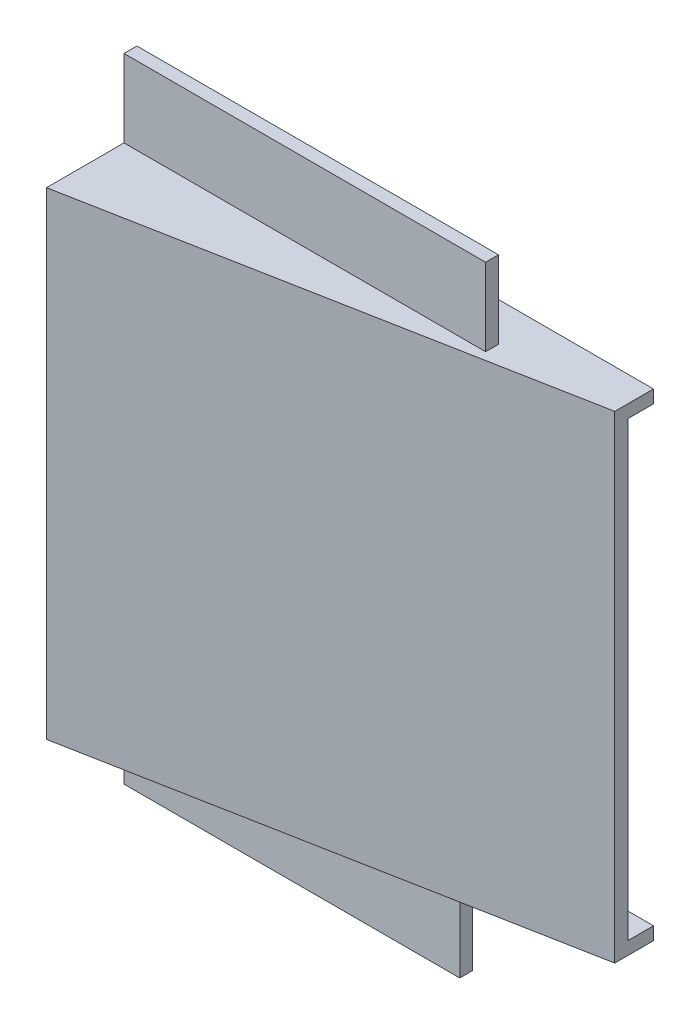
ISO-10303-21;
HEADER;
FILE_DESCRIPTION(('STEP AP214'),'2;1');
FILE_NAME('part.step','',(''),(''),'','','');
FILE_SCHEMA(('AUTOMOTIVE_DESIGN { 1 0 10303 214 1 1 1 1 }'));
ENDSEC;
DATA;
#1=APPLICATION_CONTEXT('core data for automotive mechanical design processes');
#2=APPLICATION_PROTOCOL_DEFINITION('international standard','automotive_design',2000,#1);
#3=PRODUCT_CONTEXT('',#1,'mechanical');
#4=PRODUCT('Part','Part','',(#3));
#5=PRODUCT_RELATED_PRODUCT_CATEGORY('part','',(#4));
#6=PRODUCT_DEFINITION_FORMATION('','',#4);
#7=PRODUCT_DEFINITION_CONTEXT('part definition',#1,'design');
#8=PRODUCT_DEFINITION('design','',#6,#7);
#9=PRODUCT_DEFINITION_SHAPE('','',#8);
#10=(LENGTH_UNIT() NAMED_UNIT(*) SI_UNIT(.MILLI.,.METRE.));
#11=(NAMED_UNIT(*) PLANE_ANGLE_UNIT() SI_UNIT($,.RADIAN.));
#12=(NAMED_UNIT(*) SI_UNIT($,.STERADIAN.) SOLID_ANGLE_UNIT());
#13=UNCERTAINTY_MEASURE_WITH_UNIT(LENGTH_MEASURE(1.E-05),#10,'distance_accuracy_value','');
#14=(GEOMETRIC_REPRESENTATION_CONTEXT(3) GLOBAL_UNCERTAINTY_ASSIGNED_CONTEXT((#13)) GLOBAL_UNIT_ASSIGNED_CONTEXT((#10,
#11,#12)) REPRESENTATION_CONTEXT('',''));
#15=CARTESIAN_POINT('',(0.,0.,0.));
#16=DIRECTION('',(0.,0.,1.));
#17=DIRECTION('',(1.,0.,0.));
#18=AXIS2_PLACEMENT_3D('',#15,#16,#17);
#19=CARTESIAN_POINT('',(0.,0.,50.));
#20=DIRECTION('',(0.,-1.,0.));
#21=DIRECTION('',(0.,0.,-1.));
#22=AXIS2_PLACEMENT_3D('',#19,#20,#21);
#23=PLANE('',#22);
#24=DIRECTION('',(-1.,0.,0.));
#25=VECTOR('',#24,1.);
#26=CARTESIAN_POINT('',(0.,0.,15.));
#27=LINE('',#26,#25);
#28=CARTESIAN_POINT('',(140.,0.,15.));
#29=VERTEX_POINT('',#28);
#30=CARTESIAN_POINT('',(0.,0.,15.));
#31=VERTEX_POINT('',#30);
#32=EDGE_CURVE('E56',#29,#31,#27,.T.);
#33=ORIENTED_EDGE('',*,*,#32,.F.);
#34=DIRECTION('',(0.,0.,-1.));
#35=VECTOR('',#34,1.);
#36=CARTESIAN_POINT('',(140.,0.,15.));
#37=LINE('',#36,#35);
#38=CARTESIAN_POINT('',(140.,0.,20.));
#39=VERTEX_POINT('',#38);
#40=EDGE_CURVE('E505',#39,#29,#37,.T.);
#41=ORIENTED_EDGE('',*,*,#40,.F.);
#42=DIRECTION('',(1.,0.,0.));
#43=VECTOR('',#42,1.);
#44=CARTESIAN_POINT('',(0.,0.,20.));
#45=LINE('',#44,#43);
#46=CARTESIAN_POINT('',(0.,0.,20.));
#47=VERTEX_POINT('',#46);
#48=EDGE_CURVE('E504',#47,#39,#45,.T.);
#49=ORIENTED_EDGE('',*,*,#48,.F.);
#50=DIRECTION('',(0.,0.,-1.));
#51=VECTOR('',#50,1.);
#52=CARTESIAN_POINT('',(0.,0.,50.));
#53=LINE('',#52,#51);
#54=CARTESIAN_POINT('',(0.,0.,50.));
#55=VERTEX_POINT('',#54);
#56=EDGE_CURVE('E178',#55,#47,#53,.T.);
#57=ORIENTED_EDGE('',*,*,#56,.F.);
#58=DIRECTION('',(0.982570245697068,0.,-0.185891668104851));
#59=VECTOR('',#58,1.);
#60=CARTESIAN_POINT('',(0.,0.,50.));
#61=LINE('',#60,#59);
#62=CARTESIAN_POINT('',(185.,0.,15.));
#63=VERTEX_POINT('',#62);
#64=EDGE_CURVE('E274',#55,#63,#61,.T.);
#65=ORIENTED_EDGE('',*,*,#64,.T.);
#66=DIRECTION('',(0.,0.,-1.));
#67=VECTOR('',#66,1.);
#68=CARTESIAN_POINT('',(185.,0.,50.));
#69=LINE('',#68,#67);
#70=CARTESIAN_POINT('',(185.,0.,0.));
#71=VERTEX_POINT('',#70);
#72=EDGE_CURVE('E298',#63,#71,#69,.T.);
#73=ORIENTED_EDGE('',*,*,#72,.T.);
#74=DIRECTION('',(-1.,0.,0.));
#75=VECTOR('',#74,1.);
#76=CARTESIAN_POINT('',(0.,0.,0.));
#77=LINE('',#76,#75);
#78=CARTESIAN_POINT('',(0.,0.,0.));
#79=VERTEX_POINT('',#78);
#80=EDGE_CURVE('E282',#71,#79,#77,.T.);
#81=ORIENTED_EDGE('',*,*,#80,.T.);
#82=EDGE_CURVE('E61',#31,#79,#53,.T.);
#83=ORIENTED_EDGE('',*,*,#82,.F.);
#84=EDGE_LOOP('',(#33,#41,#49,#57,#65,#73,#81,#83));
#85=FACE_BOUND('',#84,.T.);
#86=ADVANCED_FACE('F40',(#85),#23,.F.);
#87=CARTESIAN_POINT('',(0.,-185.,50.));
#88=DIRECTION('',(0.,1.,0.));
#89=DIRECTION('',(0.,0.,1.));
#90=AXIS2_PLACEMENT_3D('',#87,#88,#89);
#91=PLANE('',#90);
#92=DIRECTION('',(-1.,0.,0.));
#93=VECTOR('',#92,1.);
#94=CARTESIAN_POINT('',(0.,-185.,20.));
#95=LINE('',#94,#93);
#96=CARTESIAN_POINT('',(130.,-185.,20.));
#97=VERTEX_POINT('',#96);
#98=CARTESIAN_POINT('',(0.,-185.,20.));
#99=VERTEX_POINT('',#98);
#100=EDGE_CURVE('E196',#97,#99,#95,.T.);
#101=ORIENTED_EDGE('',*,*,#100,.F.);
#102=DIRECTION('',(0.,0.,1.));
#103=VECTOR('',#102,1.);
#104=CARTESIAN_POINT('',(130.,-185.,20.));
#105=LINE('',#104,#103);
#106=CARTESIAN_POINT('',(130.,-185.,15.));
#107=VERTEX_POINT('',#106);
#108=EDGE_CURVE('E185',#107,#97,#105,.T.);
#109=ORIENTED_EDGE('',*,*,#108,.F.);
#110=DIRECTION('',(1.,0.,0.));
#111=VECTOR('',#110,1.);
#112=CARTESIAN_POINT('',(0.,-185.,15.));
#113=LINE('',#112,#111);
#114=CARTESIAN_POINT('',(0.,-185.,15.));
#115=VERTEX_POINT('',#114);
#116=EDGE_CURVE('E180',#115,#107,#113,.T.);
#117=ORIENTED_EDGE('',*,*,#116,.F.);
#118=DIRECTION('',(0.,0.,-1.));
#119=VECTOR('',#118,1.);
#120=CARTESIAN_POINT('',(0.,-185.,50.));
#121=LINE('',#120,#119);
#122=CARTESIAN_POINT('',(0.,-185.,0.));
#123=VERTEX_POINT('',#122);
#124=EDGE_CURVE('E49',#115,#123,#121,.T.);
#125=ORIENTED_EDGE('',*,*,#124,.T.);
#126=DIRECTION('',(1.,0.,0.));
#127=VECTOR('',#126,1.);
#128=CARTESIAN_POINT('',(0.,-185.,0.));
#129=LINE('',#128,#127);
#130=CARTESIAN_POINT('',(185.,-185.,0.));
#131=VERTEX_POINT('',#130);
#132=EDGE_CURVE('E285',#123,#131,#129,.T.);
#133=ORIENTED_EDGE('',*,*,#132,.T.);
#134=DIRECTION('',(0.,0.,-1.));
#135=VECTOR('',#134,1.);
#136=CARTESIAN_POINT('',(185.,-185.,50.));
#137=LINE('',#136,#135);
#138=CARTESIAN_POINT('',(185.,-185.,15.));
#139=VERTEX_POINT('',#138);
#140=EDGE_CURVE('E301',#139,#131,#137,.T.);
#141=ORIENTED_EDGE('',*,*,#140,.F.);
#142=DIRECTION('',(0.982570245697068,0.,-0.185891668104851));
#143=VECTOR('',#142,1.);
#144=CARTESIAN_POINT('',(0.,-185.,50.));
#145=LINE('',#144,#143);
#146=CARTESIAN_POINT('',(0.,-185.,50.));
#147=VERTEX_POINT('',#146);
#148=EDGE_CURVE('E262',#147,#139,#145,.T.);
#149=ORIENTED_EDGE('',*,*,#148,.F.);
#150=EDGE_CURVE('E11',#147,#99,#121,.T.);
#151=ORIENTED_EDGE('',*,*,#150,.T.);
#152=EDGE_LOOP('',(#101,#109,#117,#125,#133,#141,#149,#151));
#153=FACE_BOUND('',#152,.T.);
#154=ADVANCED_FACE('F309',(#153),#91,.F.);
#155=CARTESIAN_POINT('',(0.,0.,50.));
#156=DIRECTION('',(1.,0.,0.));
#157=DIRECTION('',(0.,1.,0.));
#158=AXIS2_PLACEMENT_3D('',#155,#156,#157);
#159=PLANE('',#158);
#160=DIRECTION('',(0.,-1.,0.));
#161=VECTOR('',#160,1.);
#162=CARTESIAN_POINT('',(0.,0.,0.));
#163=LINE('',#162,#161);
#164=EDGE_CURVE('E278',#79,#123,#163,.T.);
#165=ORIENTED_EDGE('',*,*,#164,.T.);
#166=ORIENTED_EDGE('',*,*,#124,.F.);
#167=DIRECTION('',(0.,1.,0.));
#168=VECTOR('',#167,1.);
#169=CARTESIAN_POINT('',(0.,-215.,15.));
#170=LINE('',#169,#168);
#171=CARTESIAN_POINT('',(0.,-215.,15.));
#172=VERTEX_POINT('',#171);
#173=EDGE_CURVE('E223',#172,#115,#170,.T.);
#174=ORIENTED_EDGE('',*,*,#173,.F.);
#175=DIRECTION('',(0.,0.,-1.));
#176=VECTOR('',#175,1.);
#177=CARTESIAN_POINT('',(0.,-215.,20.));
#178=LINE('',#177,#176);
#179=CARTESIAN_POINT('',(0.,-215.,20.));
#180=VERTEX_POINT('',#179);
#181=EDGE_CURVE('E191',#180,#172,#178,.T.);
#182=ORIENTED_EDGE('',*,*,#181,.F.);
#183=DIRECTION('',(0.,1.,0.));
#184=VECTOR('',#183,1.);
#185=CARTESIAN_POINT('',(0.,-215.,20.));
#186=LINE('',#185,#184);
#187=EDGE_CURVE('E204',#180,#99,#186,.T.);
#188=ORIENTED_EDGE('',*,*,#187,.T.);
#189=ORIENTED_EDGE('',*,*,#150,.F.);
#190=DIRECTION('',(0.,-1.,0.));
#191=VECTOR('',#190,1.);
#192=CARTESIAN_POINT('',(0.,0.,50.));
#193=LINE('',#192,#191);
#194=EDGE_CURVE('E279',#55,#147,#193,.T.);
#195=ORIENTED_EDGE('',*,*,#194,.F.);
#196=ORIENTED_EDGE('',*,*,#56,.T.);
#197=DIRECTION('',(0.,-1.,0.));
#198=VECTOR('',#197,1.);
#199=CARTESIAN_POINT('',(0.,30.,20.));
#200=LINE('',#199,#198);
#201=CARTESIAN_POINT('',(0.,30.,20.));
#202=VERTEX_POINT('',#201);
#203=EDGE_CURVE('E156',#202,#47,#200,.T.);
#204=ORIENTED_EDGE('',*,*,#203,.F.);
#205=DIRECTION('',(0.,0.,1.));
#206=VECTOR('',#205,1.);
#207=CARTESIAN_POINT('',(0.,30.,15.));
#208=LINE('',#207,#206);
#209=CARTESIAN_POINT('',(0.,30.,15.));
#210=VERTEX_POINT('',#209);
#211=EDGE_CURVE('E163',#210,#202,#208,.T.);
#212=ORIENTED_EDGE('',*,*,#211,.F.);
#213=DIRECTION('',(0.,-1.,0.));
#214=VECTOR('',#213,1.);
#215=CARTESIAN_POINT('',(0.,30.,15.));
#216=LINE('',#215,#214);
#217=EDGE_CURVE('E317',#210,#31,#216,.T.);
#218=ORIENTED_EDGE('',*,*,#217,.T.);
#219=ORIENTED_EDGE('',*,*,#82,.T.);
#220=EDGE_LOOP('',(#165,#166,#174,#182,#188,#189,#195,#196,#204,#212,#218,#219));
#221=FACE_BOUND('',#220,.T.);
#222=ADVANCED_FACE('F42',(#221),#159,.F.);
#223=CARTESIAN_POINT('',(185.,0.,50.));
#224=DIRECTION('',(-1.,0.,0.));
#225=DIRECTION('',(0.,-1.,0.));
#226=AXIS2_PLACEMENT_3D('',#223,#224,#225);
#227=PLANE('',#226);
#228=DIRECTION('',(0.,-1.,0.));
#229=VECTOR('',#228,1.);
#230=CARTESIAN_POINT('',(185.,-5.,9.91130530168575));
#231=LINE('',#230,#229);
#232=CARTESIAN_POINT('',(185.,-5.,9.91130530168575));
#233=VERTEX_POINT('',#232);
#234=CARTESIAN_POINT('',(185.,-180.,9.91130530168575));
#235=VERTEX_POINT('',#234);
#236=EDGE_CURVE('E244',#233,#235,#231,.T.);
#237=ORIENTED_EDGE('',*,*,#236,.F.);
#238=DIRECTION('',(0.,0.,1.));
#239=VECTOR('',#238,1.);
#240=CARTESIAN_POINT('',(185.,-5.,0.));
#241=LINE('',#240,#239);
#242=CARTESIAN_POINT('',(185.,-5.,0.));
#243=VERTEX_POINT('',#242);
#244=EDGE_CURVE('E228',#243,#233,#241,.T.);
#245=ORIENTED_EDGE('',*,*,#244,.F.);
#246=DIRECTION('',(0.,1.,0.));
#247=VECTOR('',#246,1.);
#248=CARTESIAN_POINT('',(185.,0.,0.));
#249=LINE('',#248,#247);
#250=EDGE_CURVE('E289',#243,#71,#249,.T.);
#251=ORIENTED_EDGE('',*,*,#250,.T.);
#252=ORIENTED_EDGE('',*,*,#72,.F.);
#253=DIRECTION('',(0.,-1.,0.));
#254=VECTOR('',#253,1.);
#255=CARTESIAN_POINT('',(185.,5.00000000000003,15.));
#256=LINE('',#255,#254);
#257=EDGE_CURVE('E270',#63,#139,#256,.T.);
#258=ORIENTED_EDGE('',*,*,#257,.T.);
#259=ORIENTED_EDGE('',*,*,#140,.T.);
#260=CARTESIAN_POINT('',(185.,-180.,0.));
#261=VERTEX_POINT('',#260);
#262=EDGE_CURVE('E290',#131,#261,#249,.T.);
#263=ORIENTED_EDGE('',*,*,#262,.T.);
#264=DIRECTION('',(0.,0.,1.));
#265=VECTOR('',#264,1.);
#266=CARTESIAN_POINT('',(185.,-180.,0.));
#267=LINE('',#266,#265);
#268=EDGE_CURVE('E227',#261,#235,#267,.T.);
#269=ORIENTED_EDGE('',*,*,#268,.T.);
#270=EDGE_LOOP('',(#237,#245,#251,#252,#258,#259,#263,#269));
#271=FACE_BOUND('',#270,.T.);
#272=ADVANCED_FACE('F324',(#271),#227,.F.);
#273=CARTESIAN_POINT('',(0.,0.,0.));
#274=DIRECTION('',(0.,0.,1.));
#275=DIRECTION('',(1.,0.,0.));
#276=AXIS2_PLACEMENT_3D('',#273,#274,#275);
#277=PLANE('',#276);
#278=ORIENTED_EDGE('',*,*,#250,.F.);
#279=DIRECTION('',(1.,0.,0.));
#280=VECTOR('',#279,1.);
#281=CARTESIAN_POINT('',(5.00000000000003,-5.,0.));
#282=LINE('',#281,#280);
#283=CARTESIAN_POINT('',(5.00000000000003,-5.,0.));
#284=VERTEX_POINT('',#283);
#285=EDGE_CURVE('E241',#284,#243,#282,.T.);
#286=ORIENTED_EDGE('',*,*,#285,.F.);
#287=DIRECTION('',(0.,-1.,0.));
#288=VECTOR('',#287,1.);
#289=CARTESIAN_POINT('',(5.00000000000003,-5.,0.));
#290=LINE('',#289,#288);
#291=CARTESIAN_POINT('',(5.00000000000003,-180.,0.));
#292=VERTEX_POINT('',#291);
#293=EDGE_CURVE('E258',#284,#292,#290,.T.);
#294=ORIENTED_EDGE('',*,*,#293,.T.);
#295=DIRECTION('',(1.,0.,0.));
#296=VECTOR('',#295,1.);
#297=CARTESIAN_POINT('',(5.00000000000003,-180.,0.));
#298=LINE('',#297,#296);
#299=EDGE_CURVE('E233',#292,#261,#298,.T.);
#300=ORIENTED_EDGE('',*,*,#299,.T.);
#301=ORIENTED_EDGE('',*,*,#262,.F.);
#302=ORIENTED_EDGE('',*,*,#132,.F.);
#303=ORIENTED_EDGE('',*,*,#164,.F.);
#304=ORIENTED_EDGE('',*,*,#80,.F.);
#305=EDGE_LOOP('',(#278,#286,#294,#300,#301,#302,#303,#304));
#306=FACE_BOUND('',#305,.T.);
#307=ADVANCED_FACE('F315',(#306),#277,.F.);
#308=CARTESIAN_POINT('',(0.,5.00000000000003,50.));
#309=DIRECTION('',(-0.185891668104851,0.,-0.982570245697068));
#310=DIRECTION('',(-0.982570245697068,0.,0.185891668104851));
#311=AXIS2_PLACEMENT_3D('',#308,#309,#310);
#312=PLANE('',#311);
#313=ORIENTED_EDGE('',*,*,#194,.T.);
#314=ORIENTED_EDGE('',*,*,#148,.T.);
#315=ORIENTED_EDGE('',*,*,#257,.F.);
#316=ORIENTED_EDGE('',*,*,#64,.F.);
#317=EDGE_LOOP('',(#313,#314,#315,#316));
#318=FACE_BOUND('',#317,.T.);
#319=ADVANCED_FACE('F344',(#318),#312,.F.);
#320=CARTESIAN_POINT('',(5.00000000000002,-5.,43.9653593557398));
#321=DIRECTION('',(-1.,0.,0.));
#322=DIRECTION('',(0.,0.,1.));
#323=AXIS2_PLACEMENT_3D('',#320,#321,#322);
#324=PLANE('',#323);
#325=DIRECTION('',(0.,0.,-1.));
#326=VECTOR('',#325,1.);
#327=CARTESIAN_POINT('',(5.00000000000002,-180.,43.9653593557398));
#328=LINE('',#327,#326);
#329=CARTESIAN_POINT('',(5.00000000000002,-180.,43.9653593557398));
#330=VERTEX_POINT('',#329);
#331=EDGE_CURVE('E252',#330,#292,#328,.T.);
#332=ORIENTED_EDGE('',*,*,#331,.T.);
#333=ORIENTED_EDGE('',*,*,#293,.F.);
#334=DIRECTION('',(0.,0.,-1.));
#335=VECTOR('',#334,1.);
#336=CARTESIAN_POINT('',(5.00000000000002,-5.,43.9653593557398));
#337=LINE('',#336,#335);
#338=CARTESIAN_POINT('',(5.00000000000002,-5.,43.9653593557398));
#339=VERTEX_POINT('',#338);
#340=EDGE_CURVE('E237',#339,#284,#337,.T.);
#341=ORIENTED_EDGE('',*,*,#340,.F.);
#342=DIRECTION('',(0.,-1.,0.));
#343=VECTOR('',#342,1.);
#344=CARTESIAN_POINT('',(5.00000000000002,-5.,43.9653593557398));
#345=LINE('',#344,#343);
#346=EDGE_CURVE('E263',#339,#330,#345,.T.);
#347=ORIENTED_EDGE('',*,*,#346,.T.);
#348=EDGE_LOOP('',(#332,#333,#341,#347));
#349=FACE_BOUND('',#348,.T.);
#350=ADVANCED_FACE('F329',(#349),#324,.F.);
#351=CARTESIAN_POINT('',(185.,-5.,9.91130530168575));
#352=DIRECTION('',(0.185891668104851,0.,0.982570245697068));
#353=DIRECTION('',(0.982570245697068,0.,-0.185891668104851));
#354=AXIS2_PLACEMENT_3D('',#351,#352,#353);
#355=PLANE('',#354);
#356=DIRECTION('',(-0.982570245697068,0.,0.185891668104851));
#357=VECTOR('',#356,1.);
#358=CARTESIAN_POINT('',(185.,-180.,9.91130530168575));
#359=LINE('',#358,#357);
#360=EDGE_CURVE('E248',#235,#330,#359,.T.);
#361=ORIENTED_EDGE('',*,*,#360,.T.);
#362=ORIENTED_EDGE('',*,*,#346,.F.);
#363=DIRECTION('',(-0.982570245697068,0.,0.185891668104851));
#364=VECTOR('',#363,1.);
#365=CARTESIAN_POINT('',(185.,-5.,9.91130530168575));
#366=LINE('',#365,#364);
#367=EDGE_CURVE('E232',#233,#339,#366,.T.);
#368=ORIENTED_EDGE('',*,*,#367,.F.);
#369=ORIENTED_EDGE('',*,*,#236,.T.);
#370=EDGE_LOOP('',(#361,#362,#368,#369));
#371=FACE_BOUND('',#370,.T.);
#372=ADVANCED_FACE('F336',(#371),#355,.F.);
#373=CARTESIAN_POINT('',(0.,-5.,0.));
#374=DIRECTION('',(0.,1.,0.));
#375=DIRECTION('',(0.,0.,1.));
#376=AXIS2_PLACEMENT_3D('',#373,#374,#375);
#377=PLANE('',#376);
#378=ORIENTED_EDGE('',*,*,#244,.T.);
#379=ORIENTED_EDGE('',*,*,#367,.T.);
#380=ORIENTED_EDGE('',*,*,#340,.T.);
#381=ORIENTED_EDGE('',*,*,#285,.T.);
#382=EDGE_LOOP('',(#378,#379,#380,#381));
#383=FACE_BOUND('',#382,.T.);
#384=ADVANCED_FACE('F326',(#383),#377,.F.);
#385=CARTESIAN_POINT('',(0.,-180.,0.));
#386=DIRECTION('',(0.,1.,0.));
#387=DIRECTION('',(0.,0.,1.));
#388=AXIS2_PLACEMENT_3D('',#385,#386,#387);
#389=PLANE('',#388);
#390=ORIENTED_EDGE('',*,*,#268,.F.);
#391=ORIENTED_EDGE('',*,*,#299,.F.);
#392=ORIENTED_EDGE('',*,*,#331,.F.);
#393=ORIENTED_EDGE('',*,*,#360,.F.);
#394=EDGE_LOOP('',(#390,#391,#392,#393));
#395=FACE_BOUND('',#394,.T.);
#396=ADVANCED_FACE('F334',(#395),#389,.T.);
#397=CARTESIAN_POINT('',(0.,-215.,15.));
#398=DIRECTION('',(0.,0.,1.));
#399=DIRECTION('',(1.,0.,0.));
#400=AXIS2_PLACEMENT_3D('',#397,#398,#399);
#401=PLANE('',#400);
#402=ORIENTED_EDGE('',*,*,#116,.T.);
#403=DIRECTION('',(0.,1.,0.));
#404=VECTOR('',#403,1.);
#405=CARTESIAN_POINT('',(130.,-215.,15.));
#406=LINE('',#405,#404);
#407=CARTESIAN_POINT('',(130.,-215.,15.));
#408=VERTEX_POINT('',#407);
#409=EDGE_CURVE('E219',#408,#107,#406,.T.);
#410=ORIENTED_EDGE('',*,*,#409,.F.);
#411=DIRECTION('',(1.,0.,0.));
#412=VECTOR('',#411,1.);
#413=CARTESIAN_POINT('',(0.,-215.,15.));
#414=LINE('',#413,#412);
#415=EDGE_CURVE('E195',#172,#408,#414,.T.);
#416=ORIENTED_EDGE('',*,*,#415,.F.);
#417=ORIENTED_EDGE('',*,*,#173,.T.);
#418=EDGE_LOOP('',(#402,#410,#416,#417));
#419=FACE_BOUND('',#418,.T.);
#420=ADVANCED_FACE('F377',(#419),#401,.F.);
#421=CARTESIAN_POINT('',(130.,-215.,20.));
#422=DIRECTION('',(-1.,0.,0.));
#423=DIRECTION('',(0.,0.,1.));
#424=AXIS2_PLACEMENT_3D('',#421,#422,#423);
#425=PLANE('',#424);
#426=ORIENTED_EDGE('',*,*,#108,.T.);
#427=DIRECTION('',(0.,1.,0.));
#428=VECTOR('',#427,1.);
#429=CARTESIAN_POINT('',(130.,-215.,20.));
#430=LINE('',#429,#428);
#431=CARTESIAN_POINT('',(130.,-215.,20.));
#432=VERTEX_POINT('',#431);
#433=EDGE_CURVE('E215',#432,#97,#430,.T.);
#434=ORIENTED_EDGE('',*,*,#433,.F.);
#435=DIRECTION('',(0.,0.,1.));
#436=VECTOR('',#435,1.);
#437=CARTESIAN_POINT('',(130.,-215.,20.));
#438=LINE('',#437,#436);
#439=EDGE_CURVE('E199',#408,#432,#438,.T.);
#440=ORIENTED_EDGE('',*,*,#439,.F.);
#441=ORIENTED_EDGE('',*,*,#409,.T.);
#442=EDGE_LOOP('',(#426,#434,#440,#441));
#443=FACE_BOUND('',#442,.T.);
#444=ADVANCED_FACE('F382',(#443),#425,.F.);
#445=CARTESIAN_POINT('',(0.,-215.,20.));
#446=DIRECTION('',(0.,0.,-1.));
#447=DIRECTION('',(-1.,0.,0.));
#448=AXIS2_PLACEMENT_3D('',#445,#446,#447);
#449=PLANE('',#448);
#450=ORIENTED_EDGE('',*,*,#100,.T.);
#451=ORIENTED_EDGE('',*,*,#187,.F.);
#452=DIRECTION('',(-1.,0.,0.));
#453=VECTOR('',#452,1.);
#454=CARTESIAN_POINT('',(0.,-215.,20.));
#455=LINE('',#454,#453);
#456=EDGE_CURVE('E202',#432,#180,#455,.T.);
#457=ORIENTED_EDGE('',*,*,#456,.F.);
#458=ORIENTED_EDGE('',*,*,#433,.T.);
#459=EDGE_LOOP('',(#450,#451,#457,#458));
#460=FACE_BOUND('',#459,.T.);
#461=ADVANCED_FACE('F392',(#460),#449,.F.);
#462=CARTESIAN_POINT('',(0.,-215.,0.));
#463=DIRECTION('',(0.,-1.,0.));
#464=DIRECTION('',(0.,0.,-1.));
#465=AXIS2_PLACEMENT_3D('',#462,#463,#464);
#466=PLANE('',#465);
#467=ORIENTED_EDGE('',*,*,#181,.T.);
#468=ORIENTED_EDGE('',*,*,#415,.T.);
#469=ORIENTED_EDGE('',*,*,#439,.T.);
#470=ORIENTED_EDGE('',*,*,#456,.T.);
#471=EDGE_LOOP('',(#467,#468,#469,#470));
#472=FACE_BOUND('',#471,.T.);
#473=ADVANCED_FACE('F402',(#472),#466,.T.);
#474=CARTESIAN_POINT('',(0.,30.,20.));
#475=DIRECTION('',(0.,0.,-1.));
#476=DIRECTION('',(-1.,0.,0.));
#477=AXIS2_PLACEMENT_3D('',#474,#475,#476);
#478=PLANE('',#477);
#479=ORIENTED_EDGE('',*,*,#48,.T.);
#480=DIRECTION('',(0.,-1.,0.));
#481=VECTOR('',#480,1.);
#482=CARTESIAN_POINT('',(140.,30.,20.));
#483=LINE('',#482,#481);
#484=CARTESIAN_POINT('',(140.,30.,20.));
#485=VERTEX_POINT('',#484);
#486=EDGE_CURVE('E158',#485,#39,#483,.T.);
#487=ORIENTED_EDGE('',*,*,#486,.F.);
#488=DIRECTION('',(1.,0.,0.));
#489=VECTOR('',#488,1.);
#490=CARTESIAN_POINT('',(0.,30.,20.));
#491=LINE('',#490,#489);
#492=EDGE_CURVE('E151',#202,#485,#491,.T.);
#493=ORIENTED_EDGE('',*,*,#492,.F.);
#494=ORIENTED_EDGE('',*,*,#203,.T.);
#495=EDGE_LOOP('',(#479,#487,#493,#494));
#496=FACE_BOUND('',#495,.T.);
#497=ADVANCED_FACE('F154',(#496),#478,.F.);
#498=CARTESIAN_POINT('',(140.,30.,15.));
#499=DIRECTION('',(-1.,0.,0.));
#500=DIRECTION('',(0.,0.,1.));
#501=AXIS2_PLACEMENT_3D('',#498,#499,#500);
#502=PLANE('',#501);
#503=ORIENTED_EDGE('',*,*,#40,.T.);
#504=DIRECTION('',(0.,-1.,0.));
#505=VECTOR('',#504,1.);
#506=CARTESIAN_POINT('',(140.,30.,15.));
#507=LINE('',#506,#505);
#508=CARTESIAN_POINT('',(140.,30.,15.));
#509=VERTEX_POINT('',#508);
#510=EDGE_CURVE('E187',#509,#29,#507,.T.);
#511=ORIENTED_EDGE('',*,*,#510,.F.);
#512=DIRECTION('',(0.,0.,-1.));
#513=VECTOR('',#512,1.);
#514=CARTESIAN_POINT('',(140.,30.,15.));
#515=LINE('',#514,#513);
#516=EDGE_CURVE('E162',#485,#509,#515,.T.);
#517=ORIENTED_EDGE('',*,*,#516,.F.);
#518=ORIENTED_EDGE('',*,*,#486,.T.);
#519=EDGE_LOOP('',(#503,#511,#517,#518));
#520=FACE_BOUND('',#519,.T.);
#521=ADVANCED_FACE('F430',(#520),#502,.F.);
#522=CARTESIAN_POINT('',(0.,30.,15.));
#523=DIRECTION('',(0.,0.,1.));
#524=DIRECTION('',(1.,0.,0.));
#525=AXIS2_PLACEMENT_3D('',#522,#523,#524);
#526=PLANE('',#525);
#527=ORIENTED_EDGE('',*,*,#32,.T.);
#528=ORIENTED_EDGE('',*,*,#217,.F.);
#529=DIRECTION('',(-1.,0.,0.));
#530=VECTOR('',#529,1.);
#531=CARTESIAN_POINT('',(0.,30.,15.));
#532=LINE('',#531,#530);
#533=EDGE_CURVE('E168',#509,#210,#532,.T.);
#534=ORIENTED_EDGE('',*,*,#533,.F.);
#535=ORIENTED_EDGE('',*,*,#510,.T.);
#536=EDGE_LOOP('',(#527,#528,#534,#535));
#537=FACE_BOUND('',#536,.T.);
#538=ADVANCED_FACE('F438',(#537),#526,.F.);
#539=CARTESIAN_POINT('',(0.,30.,0.));
#540=DIRECTION('',(0.,1.,0.));
#541=DIRECTION('',(0.,0.,1.));
#542=AXIS2_PLACEMENT_3D('',#539,#540,#541);
#543=PLANE('',#542);
#544=ORIENTED_EDGE('',*,*,#211,.T.);
#545=ORIENTED_EDGE('',*,*,#492,.T.);
#546=ORIENTED_EDGE('',*,*,#516,.T.);
#547=ORIENTED_EDGE('',*,*,#533,.T.);
#548=EDGE_LOOP('',(#544,#545,#546,#547));
#549=FACE_BOUND('',#548,.T.);
#550=ADVANCED_FACE('F166',(#549),#543,.T.);
#551=CLOSED_SHELL('',(#86,#154,#222,#272,#307,#319,#350,#372,#384,#396,#420,#444,#461,#473,#497,
#521,#538,#550));
#552=MANIFOLD_SOLID_BREP('B2',#551);
#553=ADVANCED_BREP_SHAPE_REPRESENTATION('',(#18,#552),#14);
#554=SHAPE_DEFINITION_REPRESENTATION(#9,#553);
ENDSEC;
END-ISO-10303-21;
